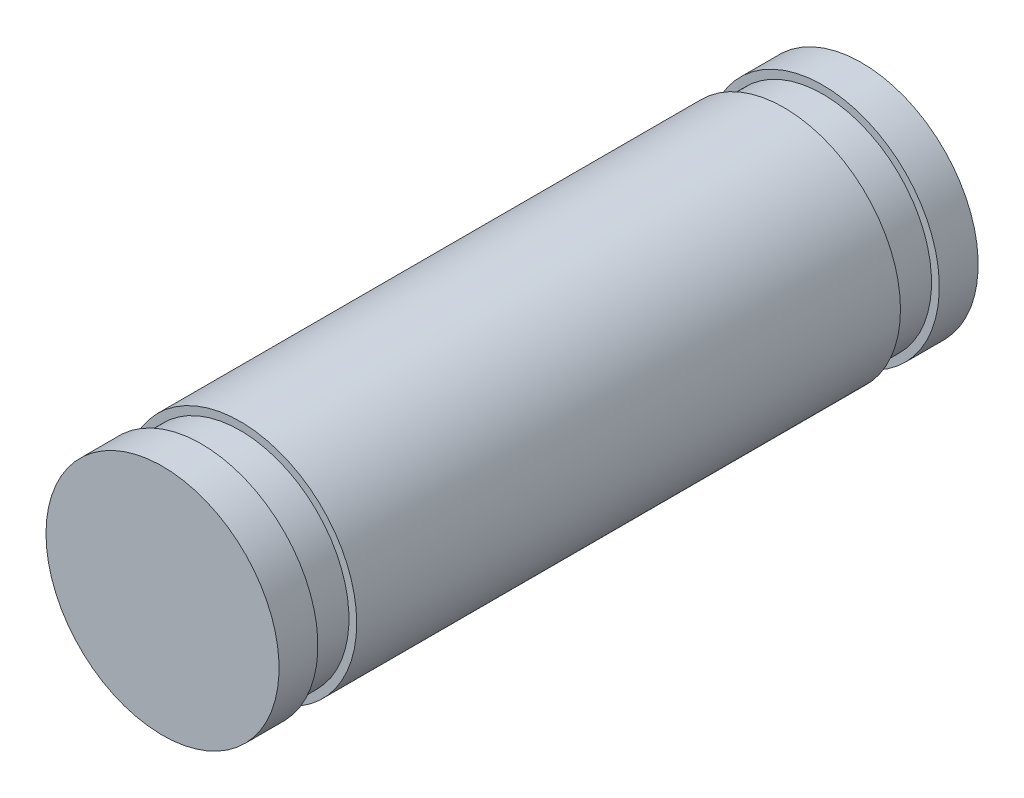
ISO-10303-21;
HEADER;
FILE_DESCRIPTION(('STEP AP214'),'2;1');
FILE_NAME('part.step','',(''),(''),'','','');
FILE_SCHEMA(('AUTOMOTIVE_DESIGN { 1 0 10303 214 1 1 1 1 }'));
ENDSEC;
DATA;
#1=APPLICATION_CONTEXT('core data for automotive mechanical design processes');
#2=APPLICATION_PROTOCOL_DEFINITION('international standard','automotive_design',2000,#1);
#3=PRODUCT_CONTEXT('',#1,'mechanical');
#4=PRODUCT('Part','Part','',(#3));
#5=PRODUCT_RELATED_PRODUCT_CATEGORY('part','',(#4));
#6=PRODUCT_DEFINITION_FORMATION('','',#4);
#7=PRODUCT_DEFINITION_CONTEXT('part definition',#1,'design');
#8=PRODUCT_DEFINITION('design','',#6,#7);
#9=PRODUCT_DEFINITION_SHAPE('','',#8);
#10=(LENGTH_UNIT() NAMED_UNIT(*) SI_UNIT(.MILLI.,.METRE.));
#11=(NAMED_UNIT(*) PLANE_ANGLE_UNIT() SI_UNIT($,.RADIAN.));
#12=(NAMED_UNIT(*) SI_UNIT($,.STERADIAN.) SOLID_ANGLE_UNIT());
#13=UNCERTAINTY_MEASURE_WITH_UNIT(LENGTH_MEASURE(1.E-05),#10,'distance_accuracy_value','');
#14=(GEOMETRIC_REPRESENTATION_CONTEXT(3) GLOBAL_UNCERTAINTY_ASSIGNED_CONTEXT((#13)) GLOBAL_UNIT_ASSIGNED_CONTEXT((#10,
#11,#12)) REPRESENTATION_CONTEXT('',''));
#15=CARTESIAN_POINT('',(0.,0.,0.));
#16=DIRECTION('',(0.,0.,1.));
#17=DIRECTION('',(1.,0.,0.));
#18=AXIS2_PLACEMENT_3D('',#15,#16,#17);
#19=CARTESIAN_POINT('',(0.,0.,7.));
#20=DIRECTION('',(0.,0.,-1.));
#21=DIRECTION('',(-1.,0.,0.));
#22=AXIS2_PLACEMENT_3D('',#19,#20,#21);
#23=CYLINDRICAL_SURFACE('',#22,1.5);
#24=CARTESIAN_POINT('',(0.,0.,7.));
#25=DIRECTION('',(0.,0.,1.));
#26=DIRECTION('',(1.,0.,0.));
#27=AXIS2_PLACEMENT_3D('',#24,#25,#26);
#28=CIRCLE('',#27,1.5);
#29=CARTESIAN_POINT('',(1.5,0.,7.));
#30=VERTEX_POINT('',#29);
#31=EDGE_CURVE('E51',#30,#30,#28,.T.);
#32=ORIENTED_EDGE('',*,*,#31,.F.);
#33=EDGE_LOOP('',(#32));
#34=FACE_BOUND('',#33,.T.);
#35=CARTESIAN_POINT('',(0.,0.,0.));
#36=DIRECTION('',(0.,0.,1.));
#37=DIRECTION('',(1.,0.,0.));
#38=AXIS2_PLACEMENT_3D('',#35,#36,#37);
#39=CIRCLE('',#38,1.5);
#40=CARTESIAN_POINT('',(1.5,0.,0.));
#41=VERTEX_POINT('',#40);
#42=EDGE_CURVE('E46',#41,#41,#39,.T.);
#43=ORIENTED_EDGE('',*,*,#42,.T.);
#44=EDGE_LOOP('',(#43));
#45=FACE_BOUND('',#44,.T.);
#46=ADVANCED_FACE('F43',(#34,#45),#23,.T.);
#47=CARTESIAN_POINT('',(0.,0.,7.));
#48=DIRECTION('',(0.,0.,1.));
#49=DIRECTION('',(1.,0.,0.));
#50=AXIS2_PLACEMENT_3D('',#47,#48,#49);
#51=PLANE('',#50);
#52=CARTESIAN_POINT('',(0.,0.,7.));
#53=DIRECTION('',(0.,0.,-1.));
#54=DIRECTION('',(-1.,0.,0.));
#55=AXIS2_PLACEMENT_3D('',#52,#53,#54);
#56=CIRCLE('',#55,1.4);
#57=CARTESIAN_POINT('',(-1.4,0.,7.));
#58=VERTEX_POINT('',#57);
#59=EDGE_CURVE('E67',#58,#58,#56,.T.);
#60=ORIENTED_EDGE('',*,*,#59,.T.);
#61=EDGE_LOOP('',(#60));
#62=FACE_BOUND('',#61,.T.);
#63=ORIENTED_EDGE('',*,*,#31,.T.);
#64=EDGE_LOOP('',(#63));
#65=FACE_BOUND('',#64,.T.);
#66=ADVANCED_FACE('F103',(#62,#65),#51,.T.);
#67=CARTESIAN_POINT('',(0.,0.,0.));
#68=DIRECTION('',(0.,0.,1.));
#69=DIRECTION('',(1.,0.,0.));
#70=AXIS2_PLACEMENT_3D('',#67,#68,#69);
#71=PLANE('',#70);
#72=CARTESIAN_POINT('',(0.,0.,0.));
#73=DIRECTION('',(0.,0.,-1.));
#74=DIRECTION('',(-1.,0.,0.));
#75=AXIS2_PLACEMENT_3D('',#72,#73,#74);
#76=CIRCLE('',#75,1.4);
#77=CARTESIAN_POINT('',(-1.4,0.,0.));
#78=VERTEX_POINT('',#77);
#79=EDGE_CURVE('E10',#78,#78,#76,.T.);
#80=ORIENTED_EDGE('',*,*,#79,.F.);
#81=EDGE_LOOP('',(#80));
#82=FACE_BOUND('',#81,.T.);
#83=ORIENTED_EDGE('',*,*,#42,.F.);
#84=EDGE_LOOP('',(#83));
#85=FACE_BOUND('',#84,.T.);
#86=ADVANCED_FACE('F109',(#82,#85),#71,.F.);
#87=CARTESIAN_POINT('',(0.,0.,-0.5));
#88=DIRECTION('',(0.,0.,1.));
#89=DIRECTION('',(1.,0.,0.));
#90=AXIS2_PLACEMENT_3D('',#87,#88,#89);
#91=CYLINDRICAL_SURFACE('',#90,1.4);
#92=CARTESIAN_POINT('',(0.,0.,-0.5));
#93=DIRECTION('',(0.,0.,-1.));
#94=DIRECTION('',(-1.,0.,0.));
#95=AXIS2_PLACEMENT_3D('',#92,#93,#94);
#96=CIRCLE('',#95,1.4);
#97=CARTESIAN_POINT('',(-1.4,0.,-0.5));
#98=VERTEX_POINT('',#97);
#99=EDGE_CURVE('E58',#98,#98,#96,.T.);
#100=ORIENTED_EDGE('',*,*,#99,.F.);
#101=EDGE_LOOP('',(#100));
#102=FACE_BOUND('',#101,.T.);
#103=ORIENTED_EDGE('',*,*,#79,.T.);
#104=EDGE_LOOP('',(#103));
#105=FACE_BOUND('',#104,.T.);
#106=ADVANCED_FACE('F118',(#102,#105),#91,.T.);
#107=CARTESIAN_POINT('',(0.,0.,-1.));
#108=DIRECTION('',(0.,0.,1.));
#109=DIRECTION('',(1.,0.,0.));
#110=AXIS2_PLACEMENT_3D('',#107,#108,#109);
#111=CYLINDRICAL_SURFACE('',#110,1.5);
#112=CARTESIAN_POINT('',(0.,0.,-1.));
#113=DIRECTION('',(0.,0.,-1.));
#114=DIRECTION('',(-1.,0.,0.));
#115=AXIS2_PLACEMENT_3D('',#112,#113,#114);
#116=CIRCLE('',#115,1.5);
#117=CARTESIAN_POINT('',(-1.5,0.,-1.));
#118=VERTEX_POINT('',#117);
#119=EDGE_CURVE('E62',#118,#118,#116,.T.);
#120=ORIENTED_EDGE('',*,*,#119,.F.);
#121=EDGE_LOOP('',(#120));
#122=FACE_BOUND('',#121,.T.);
#123=CARTESIAN_POINT('',(0.,0.,-0.5));
#124=DIRECTION('',(0.,0.,-1.));
#125=DIRECTION('',(-1.,0.,0.));
#126=AXIS2_PLACEMENT_3D('',#123,#124,#125);
#127=CIRCLE('',#126,1.5);
#128=CARTESIAN_POINT('',(-1.5,0.,-0.5));
#129=VERTEX_POINT('',#128);
#130=EDGE_CURVE('E63',#129,#129,#127,.T.);
#131=ORIENTED_EDGE('',*,*,#130,.T.);
#132=EDGE_LOOP('',(#131));
#133=FACE_BOUND('',#132,.T.);
#134=ADVANCED_FACE('F123',(#122,#133),#111,.T.);
#135=CARTESIAN_POINT('',(0.,0.,-1.));
#136=DIRECTION('',(0.,0.,-1.));
#137=DIRECTION('',(-1.,0.,0.));
#138=AXIS2_PLACEMENT_3D('',#135,#136,#137);
#139=PLANE('',#138);
#140=ORIENTED_EDGE('',*,*,#119,.T.);
#141=EDGE_LOOP('',(#140));
#142=FACE_BOUND('',#141,.T.);
#143=ADVANCED_FACE('F129',(#142),#139,.T.);
#144=CARTESIAN_POINT('',(0.,0.,-0.5));
#145=DIRECTION('',(0.,0.,-1.));
#146=DIRECTION('',(-1.,0.,0.));
#147=AXIS2_PLACEMENT_3D('',#144,#145,#146);
#148=PLANE('',#147);
#149=ORIENTED_EDGE('',*,*,#99,.T.);
#150=EDGE_LOOP('',(#149));
#151=FACE_BOUND('',#150,.T.);
#152=ORIENTED_EDGE('',*,*,#130,.F.);
#153=EDGE_LOOP('',(#152));
#154=FACE_BOUND('',#153,.T.);
#155=ADVANCED_FACE('F131',(#151,#154),#148,.F.);
#156=CARTESIAN_POINT('',(0.,0.,7.5));
#157=DIRECTION('',(0.,0.,-1.));
#158=DIRECTION('',(-1.,0.,0.));
#159=AXIS2_PLACEMENT_3D('',#156,#157,#158);
#160=CYLINDRICAL_SURFACE('',#159,1.4);
#161=CARTESIAN_POINT('',(0.,0.,7.5));
#162=DIRECTION('',(0.,0.,-1.));
#163=DIRECTION('',(-1.,0.,0.));
#164=AXIS2_PLACEMENT_3D('',#161,#162,#163);
#165=CIRCLE('',#164,1.4);
#166=CARTESIAN_POINT('',(-1.4,0.,7.5));
#167=VERTEX_POINT('',#166);
#168=EDGE_CURVE('E74',#167,#167,#165,.T.);
#169=ORIENTED_EDGE('',*,*,#168,.T.);
#170=EDGE_LOOP('',(#169));
#171=FACE_BOUND('',#170,.T.);
#172=ORIENTED_EDGE('',*,*,#59,.F.);
#173=EDGE_LOOP('',(#172));
#174=FACE_BOUND('',#173,.T.);
#175=ADVANCED_FACE('F100',(#171,#174),#160,.T.);
#176=CARTESIAN_POINT('',(0.,0.,8.));
#177=DIRECTION('',(0.,0.,-1.));
#178=DIRECTION('',(-1.,0.,0.));
#179=AXIS2_PLACEMENT_3D('',#176,#177,#178);
#180=CYLINDRICAL_SURFACE('',#179,1.5);
#181=CARTESIAN_POINT('',(0.,0.,8.));
#182=DIRECTION('',(0.,0.,-1.));
#183=DIRECTION('',(-1.,0.,0.));
#184=AXIS2_PLACEMENT_3D('',#181,#182,#183);
#185=CIRCLE('',#184,1.5);
#186=CARTESIAN_POINT('',(-1.5,0.,8.));
#187=VERTEX_POINT('',#186);
#188=EDGE_CURVE('E78',#187,#187,#185,.T.);
#189=ORIENTED_EDGE('',*,*,#188,.T.);
#190=EDGE_LOOP('',(#189));
#191=FACE_BOUND('',#190,.T.);
#192=CARTESIAN_POINT('',(0.,0.,7.5));
#193=DIRECTION('',(0.,0.,-1.));
#194=DIRECTION('',(-1.,0.,0.));
#195=AXIS2_PLACEMENT_3D('',#192,#193,#194);
#196=CIRCLE('',#195,1.5);
#197=CARTESIAN_POINT('',(-1.5,0.,7.5));
#198=VERTEX_POINT('',#197);
#199=EDGE_CURVE('E79',#198,#198,#196,.T.);
#200=ORIENTED_EDGE('',*,*,#199,.F.);
#201=EDGE_LOOP('',(#200));
#202=FACE_BOUND('',#201,.T.);
#203=ADVANCED_FACE('F87',(#191,#202),#180,.T.);
#204=CARTESIAN_POINT('',(0.,0.,8.));
#205=DIRECTION('',(0.,0.,1.));
#206=DIRECTION('',(-1.,0.,0.));
#207=AXIS2_PLACEMENT_3D('',#204,#205,#206);
#208=PLANE('',#207);
#209=ORIENTED_EDGE('',*,*,#188,.F.);
#210=EDGE_LOOP('',(#209));
#211=FACE_BOUND('',#210,.T.);
#212=ADVANCED_FACE('F90',(#211),#208,.T.);
#213=CARTESIAN_POINT('',(0.,0.,7.5));
#214=DIRECTION('',(0.,0.,1.));
#215=DIRECTION('',(-1.,0.,0.));
#216=AXIS2_PLACEMENT_3D('',#213,#214,#215);
#217=PLANE('',#216);
#218=ORIENTED_EDGE('',*,*,#168,.F.);
#219=EDGE_LOOP('',(#218));
#220=FACE_BOUND('',#219,.T.);
#221=ORIENTED_EDGE('',*,*,#199,.T.);
#222=EDGE_LOOP('',(#221));
#223=FACE_BOUND('',#222,.T.);
#224=ADVANCED_FACE('F92',(#220,#223),#217,.F.);
#225=CLOSED_SHELL('',(#46,#66,#86,#106,#134,#143,#155,#175,#203,#212,#224));
#226=MANIFOLD_SOLID_BREP('B2',#225);
#227=ADVANCED_BREP_SHAPE_REPRESENTATION('',(#18,#226),#14);
#228=SHAPE_DEFINITION_REPRESENTATION(#9,#227);
ENDSEC;
END-ISO-10303-21;
